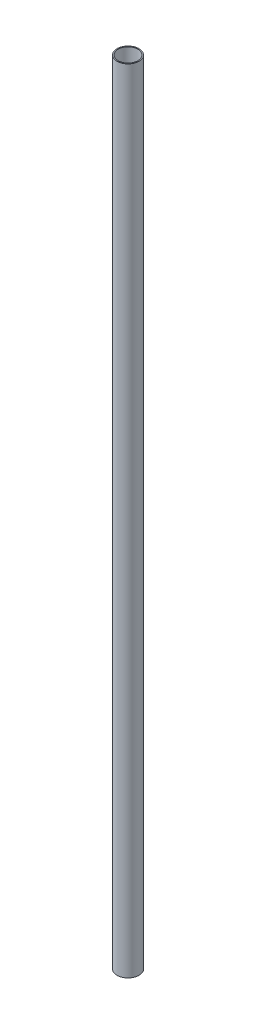
ISO-10303-21;
HEADER;
FILE_DESCRIPTION(('STEP AP214'),'2;1');
FILE_NAME('part.step','',(''),(''),'','','');
FILE_SCHEMA(('AUTOMOTIVE_DESIGN { 1 0 10303 214 1 1 1 1 }'));
ENDSEC;
DATA;
#1=APPLICATION_CONTEXT('core data for automotive mechanical design processes');
#2=APPLICATION_PROTOCOL_DEFINITION('international standard','automotive_design',2000,#1);
#3=PRODUCT_CONTEXT('',#1,'mechanical');
#4=PRODUCT('Part','Part','',(#3));
#5=PRODUCT_RELATED_PRODUCT_CATEGORY('part','',(#4));
#6=PRODUCT_DEFINITION_FORMATION('','',#4);
#7=PRODUCT_DEFINITION_CONTEXT('part definition',#1,'design');
#8=PRODUCT_DEFINITION('design','',#6,#7);
#9=PRODUCT_DEFINITION_SHAPE('','',#8);
#10=(LENGTH_UNIT() NAMED_UNIT(*) SI_UNIT(.MILLI.,.METRE.));
#11=(NAMED_UNIT(*) PLANE_ANGLE_UNIT() SI_UNIT($,.RADIAN.));
#12=(NAMED_UNIT(*) SI_UNIT($,.STERADIAN.) SOLID_ANGLE_UNIT());
#13=UNCERTAINTY_MEASURE_WITH_UNIT(LENGTH_MEASURE(1.E-05),#10,'distance_accuracy_value','');
#14=(GEOMETRIC_REPRESENTATION_CONTEXT(3) GLOBAL_UNCERTAINTY_ASSIGNED_CONTEXT((#13)) GLOBAL_UNIT_ASSIGNED_CONTEXT((#10,
#11,#12)) REPRESENTATION_CONTEXT('',''));
#15=CARTESIAN_POINT('',(0.,0.,0.));
#16=DIRECTION('',(0.,0.,1.));
#17=DIRECTION('',(1.,0.,0.));
#18=AXIS2_PLACEMENT_3D('',#15,#16,#17);
#19=CARTESIAN_POINT('',(0.,915.,0.));
#20=DIRECTION('',(0.,1.,0.));
#21=DIRECTION('',(0.,0.,1.));
#22=AXIS2_PLACEMENT_3D('',#19,#20,#21);
#23=PLANE('',#22);
#24=CARTESIAN_POINT('',(0.,915.,0.));
#25=DIRECTION('',(0.,1.,0.));
#26=DIRECTION('',(0.,0.,1.));
#27=AXIS2_PLACEMENT_3D('',#24,#25,#26);
#28=CIRCLE('',#27,12.7);
#29=CARTESIAN_POINT('',(0.,915.,-12.7));
#30=VERTEX_POINT('',#29);
#31=EDGE_CURVE('E10',#30,#30,#28,.T.);
#32=ORIENTED_EDGE('',*,*,#31,.T.);
#33=EDGE_LOOP('',(#32));
#34=FACE_BOUND('',#33,.T.);
#35=CARTESIAN_POINT('',(0.,915.,0.));
#36=DIRECTION('',(0.,1.,0.));
#37=DIRECTION('',(0.,0.,1.));
#38=AXIS2_PLACEMENT_3D('',#35,#36,#37);
#39=CIRCLE('',#38,11.5);
#40=CARTESIAN_POINT('',(0.,915.,-11.5));
#41=VERTEX_POINT('',#40);
#42=EDGE_CURVE('E56',#41,#41,#39,.T.);
#43=ORIENTED_EDGE('',*,*,#42,.F.);
#44=EDGE_LOOP('',(#43));
#45=FACE_BOUND('',#44,.T.);
#46=ADVANCED_FACE('F43',(#34,#45),#23,.T.);
#47=CARTESIAN_POINT('',(0.,0.,0.));
#48=DIRECTION('',(0.,1.,0.));
#49=DIRECTION('',(0.,0.,1.));
#50=AXIS2_PLACEMENT_3D('',#47,#48,#49);
#51=PLANE('',#50);
#52=CARTESIAN_POINT('',(0.,0.,0.));
#53=DIRECTION('',(0.,1.,0.));
#54=DIRECTION('',(0.,0.,1.));
#55=AXIS2_PLACEMENT_3D('',#52,#53,#54);
#56=CIRCLE('',#55,12.7);
#57=CARTESIAN_POINT('',(0.,-1.11022302462516E-13,-12.7));
#58=VERTEX_POINT('',#57);
#59=EDGE_CURVE('E47',#58,#58,#56,.T.);
#60=ORIENTED_EDGE('',*,*,#59,.F.);
#61=EDGE_LOOP('',(#60));
#62=FACE_BOUND('',#61,.T.);
#63=CARTESIAN_POINT('',(0.,0.,0.));
#64=DIRECTION('',(0.,1.,0.));
#65=DIRECTION('',(0.,0.,1.));
#66=AXIS2_PLACEMENT_3D('',#63,#64,#65);
#67=CIRCLE('',#66,11.5);
#68=CARTESIAN_POINT('',(0.,-1.11022302462516E-13,-11.5));
#69=VERTEX_POINT('',#68);
#70=EDGE_CURVE('E58',#69,#69,#67,.T.);
#71=ORIENTED_EDGE('',*,*,#70,.T.);
#72=EDGE_LOOP('',(#71));
#73=FACE_BOUND('',#72,.T.);
#74=ADVANCED_FACE('F70',(#62,#73),#51,.F.);
#75=CARTESIAN_POINT('',(0.,915.,0.));
#76=DIRECTION('',(0.,-1.,0.));
#77=DIRECTION('',(0.,0.,-1.));
#78=AXIS2_PLACEMENT_3D('',#75,#76,#77);
#79=CYLINDRICAL_SURFACE('',#78,12.7);
#80=CARTESIAN_POINT('',(0.,915.,-12.7));
#81=CARTESIAN_POINT('',(0.,905.46875,-12.7));
#82=CARTESIAN_POINT('',(0.,895.9375,-12.7));
#83=CARTESIAN_POINT('',(0.,876.875,-12.7));
#84=CARTESIAN_POINT('',(0.,867.34375,-12.7));
#85=CARTESIAN_POINT('',(0.,848.28125,-12.7));
#86=CARTESIAN_POINT('',(0.,838.75,-12.7));
#87=CARTESIAN_POINT('',(0.,819.6875,-12.7));
#88=CARTESIAN_POINT('',(0.,810.15625,-12.7));
#89=CARTESIAN_POINT('',(0.,791.09375,-12.7));
#90=CARTESIAN_POINT('',(0.,781.5625,-12.7));
#91=CARTESIAN_POINT('',(0.,762.5,-12.7));
#92=CARTESIAN_POINT('',(0.,752.96875,-12.7));
#93=CARTESIAN_POINT('',(0.,733.90625,-12.7));
#94=CARTESIAN_POINT('',(0.,724.375,-12.7));
#95=CARTESIAN_POINT('',(0.,705.3125,-12.7));
#96=CARTESIAN_POINT('',(0.,695.78125,-12.7));
#97=CARTESIAN_POINT('',(0.,676.71875,-12.7));
#98=CARTESIAN_POINT('',(0.,667.1875,-12.7));
#99=CARTESIAN_POINT('',(0.,648.125,-12.7));
#100=CARTESIAN_POINT('',(0.,638.59375,-12.7));
#101=CARTESIAN_POINT('',(0.,619.53125,-12.7));
#102=CARTESIAN_POINT('',(0.,610.,-12.7));
#103=CARTESIAN_POINT('',(0.,590.9375,-12.7));
#104=CARTESIAN_POINT('',(0.,581.40625,-12.7));
#105=CARTESIAN_POINT('',(0.,562.34375,-12.7));
#106=CARTESIAN_POINT('',(0.,552.8125,-12.7));
#107=CARTESIAN_POINT('',(0.,533.75,-12.7));
#108=CARTESIAN_POINT('',(0.,524.21875,-12.7));
#109=CARTESIAN_POINT('',(0.,505.15625,-12.7));
#110=CARTESIAN_POINT('',(0.,495.625,-12.7));
#111=CARTESIAN_POINT('',(0.,476.5625,-12.7));
#112=CARTESIAN_POINT('',(0.,467.03125,-12.7));
#113=CARTESIAN_POINT('',(0.,447.96875,-12.7));
#114=CARTESIAN_POINT('',(0.,438.4375,-12.7));
#115=CARTESIAN_POINT('',(0.,419.375,-12.7));
#116=CARTESIAN_POINT('',(0.,409.84375,-12.7));
#117=CARTESIAN_POINT('',(0.,390.78125,-12.7));
#118=CARTESIAN_POINT('',(0.,381.25,-12.7));
#119=CARTESIAN_POINT('',(0.,362.1875,-12.7));
#120=CARTESIAN_POINT('',(0.,352.65625,-12.7));
#121=CARTESIAN_POINT('',(0.,333.59375,-12.7));
#122=CARTESIAN_POINT('',(0.,324.0625,-12.7));
#123=CARTESIAN_POINT('',(0.,305.,-12.7));
#124=CARTESIAN_POINT('',(0.,295.46875,-12.7));
#125=CARTESIAN_POINT('',(0.,276.40625,-12.7));
#126=CARTESIAN_POINT('',(0.,266.875,-12.7));
#127=CARTESIAN_POINT('',(0.,247.8125,-12.7));
#128=CARTESIAN_POINT('',(0.,238.28125,-12.7));
#129=CARTESIAN_POINT('',(0.,219.21875,-12.7));
#130=CARTESIAN_POINT('',(0.,209.6875,-12.7));
#131=CARTESIAN_POINT('',(0.,190.625,-12.7));
#132=CARTESIAN_POINT('',(0.,181.09375,-12.7));
#133=CARTESIAN_POINT('',(0.,162.03125,-12.7));
#134=CARTESIAN_POINT('',(0.,152.5,-12.7));
#135=CARTESIAN_POINT('',(0.,133.4375,-12.7));
#136=CARTESIAN_POINT('',(0.,123.90625,-12.7));
#137=CARTESIAN_POINT('',(0.,104.84375,-12.7));
#138=CARTESIAN_POINT('',(0.,95.3124999999999,-12.7));
#139=CARTESIAN_POINT('',(0.,76.2499999999999,-12.7));
#140=CARTESIAN_POINT('',(0.,66.7187499999999,-12.7));
#141=CARTESIAN_POINT('',(0.,47.6562499999999,-12.7));
#142=CARTESIAN_POINT('',(0.,38.1249999999999,-12.7));
#143=CARTESIAN_POINT('',(0.,19.0624999999999,-12.7));
#144=CARTESIAN_POINT('',(0.,9.53124999999987,-12.7));
#145=CARTESIAN_POINT('',(0.,-1.11022302462516E-13,-12.7));
#146=B_SPLINE_CURVE_WITH_KNOTS('',3,(#80,#81,#82,#83,#84,#85,#86,#87,#88,#89,#90,#91,#92,#93,
#94,#95,#96,#97,#98,#99,#100,#101,#102,#103,#104,#105,#106,#107,#108,#109,#110,#111,#112,#113,
#114,#115,#116,#117,#118,#119,#120,#121,#122,#123,#124,#125,#126,#127,#128,#129,#130,#131,#132,
#133,#134,#135,#136,#137,#138,#139,#140,#141,#142,#143,#144,#145),.UNSPECIFIED.,.F.,.F.,(4,2,2,
2,2,2,2,2,2,2,2,2,2,2,2,2,2,2,2,2,2,2,2,2,2,2,2,2,2,2,2,2,4),(0.,28.5937500000001,
57.1875000000001,85.78125,114.375,142.96875,171.5625,200.15625,228.75,257.34375,285.9375,
314.53125,343.125,371.71875,400.3125,428.90625,457.5,486.09375,514.6875,543.28125,571.875,
600.46875,629.0625,657.65625,686.25,714.84375,743.4375,772.03125,800.625,829.21875,857.8125,
886.40625,915.),.UNSPECIFIED.);
#147=EDGE_CURVE('BSEAM45',#30,#58,#146,.T.);
#148=ORIENTED_EDGE('',*,*,#31,.F.);
#149=ORIENTED_EDGE('',*,*,#59,.T.);
#150=ORIENTED_EDGE('',*,*,#147,.T.);
#151=ORIENTED_EDGE('',*,*,#147,.F.);
#152=EDGE_LOOP('',(#148,#150,#149,#151));
#153=FACE_BOUND('',#152,.T.);
#154=ADVANCED_FACE('F45',(#153),#79,.T.);
#155=CARTESIAN_POINT('',(0.,915.,0.));
#156=DIRECTION('',(0.,-1.,0.));
#157=DIRECTION('',(0.,0.,-1.));
#158=AXIS2_PLACEMENT_3D('',#155,#156,#157);
#159=CYLINDRICAL_SURFACE('',#158,11.5);
#160=CARTESIAN_POINT('',(0.,915.,-11.5));
#161=CARTESIAN_POINT('',(0.,905.46875,-11.5));
#162=CARTESIAN_POINT('',(0.,895.9375,-11.5));
#163=CARTESIAN_POINT('',(0.,876.875,-11.5));
#164=CARTESIAN_POINT('',(0.,867.34375,-11.5));
#165=CARTESIAN_POINT('',(0.,848.28125,-11.5));
#166=CARTESIAN_POINT('',(0.,838.75,-11.5));
#167=CARTESIAN_POINT('',(0.,819.6875,-11.5));
#168=CARTESIAN_POINT('',(0.,810.15625,-11.5));
#169=CARTESIAN_POINT('',(0.,791.09375,-11.5));
#170=CARTESIAN_POINT('',(0.,781.5625,-11.5));
#171=CARTESIAN_POINT('',(0.,762.5,-11.5));
#172=CARTESIAN_POINT('',(0.,752.96875,-11.5));
#173=CARTESIAN_POINT('',(0.,733.90625,-11.5));
#174=CARTESIAN_POINT('',(0.,724.375,-11.5));
#175=CARTESIAN_POINT('',(0.,705.3125,-11.5));
#176=CARTESIAN_POINT('',(0.,695.78125,-11.5));
#177=CARTESIAN_POINT('',(0.,676.71875,-11.5));
#178=CARTESIAN_POINT('',(0.,667.1875,-11.5));
#179=CARTESIAN_POINT('',(0.,648.125,-11.5));
#180=CARTESIAN_POINT('',(0.,638.59375,-11.5));
#181=CARTESIAN_POINT('',(0.,619.53125,-11.5));
#182=CARTESIAN_POINT('',(0.,610.,-11.5));
#183=CARTESIAN_POINT('',(0.,590.9375,-11.5));
#184=CARTESIAN_POINT('',(0.,581.40625,-11.5));
#185=CARTESIAN_POINT('',(0.,562.34375,-11.5));
#186=CARTESIAN_POINT('',(0.,552.8125,-11.5));
#187=CARTESIAN_POINT('',(0.,533.75,-11.5));
#188=CARTESIAN_POINT('',(0.,524.21875,-11.5));
#189=CARTESIAN_POINT('',(0.,505.15625,-11.5));
#190=CARTESIAN_POINT('',(0.,495.625,-11.5));
#191=CARTESIAN_POINT('',(0.,476.5625,-11.5));
#192=CARTESIAN_POINT('',(0.,467.03125,-11.5));
#193=CARTESIAN_POINT('',(0.,447.96875,-11.5));
#194=CARTESIAN_POINT('',(0.,438.4375,-11.5));
#195=CARTESIAN_POINT('',(0.,419.375,-11.5));
#196=CARTESIAN_POINT('',(0.,409.84375,-11.5));
#197=CARTESIAN_POINT('',(0.,390.78125,-11.5));
#198=CARTESIAN_POINT('',(0.,381.25,-11.5));
#199=CARTESIAN_POINT('',(0.,362.1875,-11.5));
#200=CARTESIAN_POINT('',(0.,352.65625,-11.5));
#201=CARTESIAN_POINT('',(0.,333.59375,-11.5));
#202=CARTESIAN_POINT('',(0.,324.0625,-11.5));
#203=CARTESIAN_POINT('',(0.,305.,-11.5));
#204=CARTESIAN_POINT('',(0.,295.46875,-11.5));
#205=CARTESIAN_POINT('',(0.,276.40625,-11.5));
#206=CARTESIAN_POINT('',(0.,266.875,-11.5));
#207=CARTESIAN_POINT('',(0.,247.8125,-11.5));
#208=CARTESIAN_POINT('',(0.,238.28125,-11.5));
#209=CARTESIAN_POINT('',(0.,219.21875,-11.5));
#210=CARTESIAN_POINT('',(0.,209.6875,-11.5));
#211=CARTESIAN_POINT('',(0.,190.625,-11.5));
#212=CARTESIAN_POINT('',(0.,181.09375,-11.5));
#213=CARTESIAN_POINT('',(0.,162.03125,-11.5));
#214=CARTESIAN_POINT('',(0.,152.5,-11.5));
#215=CARTESIAN_POINT('',(0.,133.4375,-11.5));
#216=CARTESIAN_POINT('',(0.,123.90625,-11.5));
#217=CARTESIAN_POINT('',(0.,104.84375,-11.5));
#218=CARTESIAN_POINT('',(0.,95.3124999999999,-11.5));
#219=CARTESIAN_POINT('',(0.,76.2499999999999,-11.5));
#220=CARTESIAN_POINT('',(0.,66.7187499999999,-11.5));
#221=CARTESIAN_POINT('',(0.,47.6562499999999,-11.5));
#222=CARTESIAN_POINT('',(0.,38.1249999999999,-11.5));
#223=CARTESIAN_POINT('',(0.,19.0624999999999,-11.5));
#224=CARTESIAN_POINT('',(0.,9.53124999999987,-11.5));
#225=CARTESIAN_POINT('',(0.,-1.11022302462516E-13,-11.5));
#226=B_SPLINE_CURVE_WITH_KNOTS('',3,(#160,#161,#162,#163,#164,#165,#166,#167,#168,#169,#170,
#171,#172,#173,#174,#175,#176,#177,#178,#179,#180,#181,#182,#183,#184,#185,#186,#187,#188,#189,
#190,#191,#192,#193,#194,#195,#196,#197,#198,#199,#200,#201,#202,#203,#204,#205,#206,#207,#208,
#209,#210,#211,#212,#213,#214,#215,#216,#217,#218,#219,#220,#221,#222,#223,#224,#225),
.UNSPECIFIED.,.F.,.F.,(4,2,2,2,2,2,2,2,2,2,2,2,2,2,2,2,2,2,2,2,2,2,2,2,2,2,2,2,2,2,2,2,4),(0.,
28.5937500000001,57.1875000000001,85.78125,114.375,142.96875,171.5625,200.15625,228.75,
257.34375,285.9375,314.53125,343.125,371.71875,400.3125,428.90625,457.5,486.09375,514.6875,
543.28125,571.875,600.46875,629.0625,657.65625,686.25,714.84375,743.4375,772.03125,800.625,
829.21875,857.8125,886.40625,915.),.UNSPECIFIED.);
#227=EDGE_CURVE('BSEAM66',#41,#69,#226,.T.);
#228=ORIENTED_EDGE('',*,*,#42,.T.);
#229=ORIENTED_EDGE('',*,*,#70,.F.);
#230=ORIENTED_EDGE('',*,*,#227,.T.);
#231=ORIENTED_EDGE('',*,*,#227,.F.);
#232=EDGE_LOOP('',(#228,#230,#229,#231));
#233=FACE_BOUND('',#232,.T.);
#234=ADVANCED_FACE('F66',(#233),#159,.F.);
#235=CLOSED_SHELL('',(#46,#74,#154,#234));
#236=MANIFOLD_SOLID_BREP('B2',#235);
#237=ADVANCED_BREP_SHAPE_REPRESENTATION('',(#18,#236),#14);
#238=SHAPE_DEFINITION_REPRESENTATION(#9,#237);
ENDSEC;
END-ISO-10303-21;
